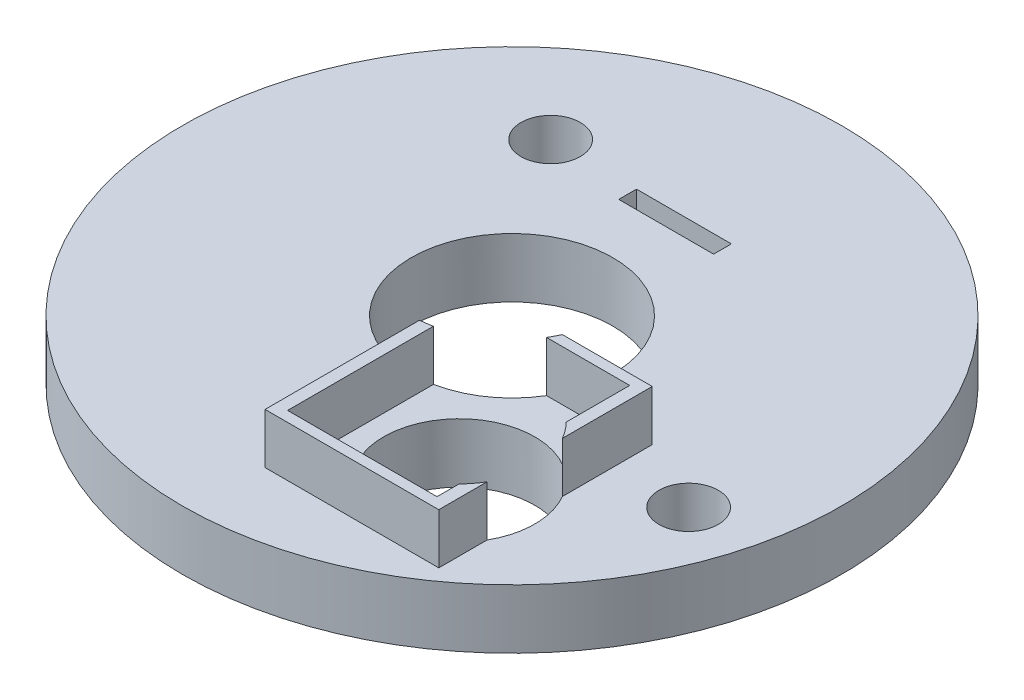
ISO-10303-21;
HEADER;
FILE_DESCRIPTION(('STEP AP214'),'2;1');
FILE_NAME('part.step','',(''),(''),'','','');
FILE_SCHEMA(('AUTOMOTIVE_DESIGN { 1 0 10303 214 1 1 1 1 }'));
ENDSEC;
DATA;
#1=APPLICATION_CONTEXT('core data for automotive mechanical design processes');
#2=APPLICATION_PROTOCOL_DEFINITION('international standard','automotive_design',2000,#1);
#3=PRODUCT_CONTEXT('',#1,'mechanical');
#4=PRODUCT('Part','Part','',(#3));
#5=PRODUCT_RELATED_PRODUCT_CATEGORY('part','',(#4));
#6=PRODUCT_DEFINITION_FORMATION('','',#4);
#7=PRODUCT_DEFINITION_CONTEXT('part definition',#1,'design');
#8=PRODUCT_DEFINITION('design','',#6,#7);
#9=PRODUCT_DEFINITION_SHAPE('','',#8);
#10=(LENGTH_UNIT() NAMED_UNIT(*) SI_UNIT(.MILLI.,.METRE.));
#11=(NAMED_UNIT(*) PLANE_ANGLE_UNIT() SI_UNIT($,.RADIAN.));
#12=(NAMED_UNIT(*) SI_UNIT($,.STERADIAN.) SOLID_ANGLE_UNIT());
#13=UNCERTAINTY_MEASURE_WITH_UNIT(LENGTH_MEASURE(1.E-05),#10,'distance_accuracy_value','');
#14=(GEOMETRIC_REPRESENTATION_CONTEXT(3) GLOBAL_UNCERTAINTY_ASSIGNED_CONTEXT((#13)) GLOBAL_UNIT_ASSIGNED_CONTEXT((#10,
#11,#12)) REPRESENTATION_CONTEXT('',''));
#15=CARTESIAN_POINT('',(0.,0.,0.));
#16=DIRECTION('',(0.,0.,1.));
#17=DIRECTION('',(1.,0.,0.));
#18=AXIS2_PLACEMENT_3D('',#15,#16,#17);
#19=CARTESIAN_POINT('',(0.,8.5,0.));
#20=DIRECTION('',(0.,-1.,0.));
#21=DIRECTION('',(0.,0.,-1.));
#22=AXIS2_PLACEMENT_3D('',#19,#20,#21);
#23=PLANE('',#22);
#24=CARTESIAN_POINT('',(0.,8.5,0.));
#25=DIRECTION('',(0.,-1.,0.));
#26=DIRECTION('',(0.,0.,-1.));
#27=AXIS2_PLACEMENT_3D('',#24,#25,#26);
#28=CIRCLE('',#27,17.);
#29=CARTESIAN_POINT('',(1.35,8.5,16.9463122832078));
#30=VERTEX_POINT('',#29);
#31=CARTESIAN_POINT('',(3.4,8.5,16.6565302509256));
#32=VERTEX_POINT('',#31);
#33=EDGE_CURVE('E257',#30,#32,#28,.F.);
#34=ORIENTED_EDGE('',*,*,#33,.F.);
#35=DIRECTION('',(0.,0.,1.));
#36=VECTOR('',#35,1.);
#37=CARTESIAN_POINT('',(1.35,8.5,7.00000000000001));
#38=LINE('',#37,#36);
#39=CARTESIAN_POINT('',(1.35,8.5,43.));
#40=VERTEX_POINT('',#39);
#41=EDGE_CURVE('E358',#30,#40,#38,.T.);
#42=ORIENTED_EDGE('',*,*,#41,.T.);
#43=DIRECTION('',(1.,0.,0.));
#44=VECTOR('',#43,1.);
#45=CARTESIAN_POINT('',(1.35,8.5,43.));
#46=LINE('',#45,#44);
#47=CARTESIAN_POINT('',(30.65,8.5,43.));
#48=VERTEX_POINT('',#47);
#49=EDGE_CURVE('E345',#40,#48,#46,.T.);
#50=ORIENTED_EDGE('',*,*,#49,.T.);
#51=DIRECTION('',(0.,0.,1.));
#52=VECTOR('',#51,1.);
#53=CARTESIAN_POINT('',(30.65,8.5,7.00000000000001));
#54=LINE('',#53,#52);
#55=CARTESIAN_POINT('',(30.65,8.5,34.8608175575157));
#56=VERTEX_POINT('',#55);
#57=EDGE_CURVE('E349',#56,#48,#54,.T.);
#58=ORIENTED_EDGE('',*,*,#57,.F.);
#59=CARTESIAN_POINT('',(19.6,8.5,28.5));
#60=DIRECTION('',(0.,-1.,0.));
#61=DIRECTION('',(0.,0.,-1.));
#62=AXIS2_PLACEMENT_3D('',#59,#60,#61);
#63=CIRCLE('',#62,12.75);
#64=CARTESIAN_POINT('',(28.6,8.5,37.5311959340942));
#65=VERTEX_POINT('',#64);
#66=EDGE_CURVE('E282',#65,#56,#63,.F.);
#67=ORIENTED_EDGE('',*,*,#66,.F.);
#68=DIRECTION('',(0.,0.,1.));
#69=VECTOR('',#68,1.);
#70=CARTESIAN_POINT('',(28.6,8.5,8.75));
#71=LINE('',#70,#69);
#72=CARTESIAN_POINT('',(28.6,8.5,41.25));
#73=VERTEX_POINT('',#72);
#74=EDGE_CURVE('E302',#65,#73,#71,.T.);
#75=ORIENTED_EDGE('',*,*,#74,.T.);
#76=DIRECTION('',(1.,0.,0.));
#77=VECTOR('',#76,1.);
#78=CARTESIAN_POINT('',(3.4,8.5,41.25));
#79=LINE('',#78,#77);
#80=CARTESIAN_POINT('',(3.4,8.5,41.25));
#81=VERTEX_POINT('',#80);
#82=EDGE_CURVE('E299',#81,#73,#79,.T.);
#83=ORIENTED_EDGE('',*,*,#82,.F.);
#84=DIRECTION('',(0.,0.,1.));
#85=VECTOR('',#84,1.);
#86=CARTESIAN_POINT('',(3.4,8.5,8.75));
#87=LINE('',#86,#85);
#88=EDGE_CURVE('E311',#32,#81,#87,.T.);
#89=ORIENTED_EDGE('',*,*,#88,.F.);
#90=EDGE_LOOP('',(#34,#42,#50,#58,#67,#75,#83,#89));
#91=FACE_BOUND('',#90,.T.);
#92=ADVANCED_FACE('F68',(#91),#23,.F.);
#93=CARTESIAN_POINT('',(1.35,8.5,7.00000000000001));
#94=DIRECTION('',(0.,0.,-1.));
#95=DIRECTION('',(-1.,0.,0.));
#96=AXIS2_PLACEMENT_3D('',#93,#94,#95);
#97=PLANE('',#96);
#98=DIRECTION('',(1.,0.,0.));
#99=VECTOR('',#98,1.);
#100=CARTESIAN_POINT('',(1.35,0.,7.00000000000001));
#101=LINE('',#100,#99);
#102=CARTESIAN_POINT('',(15.4919333848297,0.,7.00000000000001));
#103=VERTEX_POINT('',#102);
#104=CARTESIAN_POINT('',(30.65,0.,7.00000000000001));
#105=VERTEX_POINT('',#104);
#106=EDGE_CURVE('E332',#103,#105,#101,.T.);
#107=ORIENTED_EDGE('',*,*,#106,.F.);
#108=DIRECTION('',(0.,-1.,0.));
#109=VECTOR('',#108,1.);
#110=CARTESIAN_POINT('',(15.4919333848297,10.,7.00000000000001));
#111=LINE('',#110,#109);
#112=CARTESIAN_POINT('',(15.4919333848297,8.5,7.00000000000001));
#113=VERTEX_POINT('',#112);
#114=EDGE_CURVE('E270',#103,#113,#111,.F.);
#115=ORIENTED_EDGE('',*,*,#114,.T.);
#116=DIRECTION('',(1.,0.,0.));
#117=VECTOR('',#116,1.);
#118=CARTESIAN_POINT('',(1.35,8.5,7.00000000000001));
#119=LINE('',#118,#117);
#120=CARTESIAN_POINT('',(30.65,8.5,7.00000000000001));
#121=VERTEX_POINT('',#120);
#122=EDGE_CURVE('E355',#113,#121,#119,.T.);
#123=ORIENTED_EDGE('',*,*,#122,.T.);
#124=DIRECTION('',(0.,-1.,0.));
#125=VECTOR('',#124,1.);
#126=CARTESIAN_POINT('',(30.65,8.5,7.00000000000001));
#127=LINE('',#126,#125);
#128=EDGE_CURVE('E379',#121,#105,#127,.T.);
#129=ORIENTED_EDGE('',*,*,#128,.T.);
#130=EDGE_LOOP('',(#107,#115,#123,#129));
#131=FACE_BOUND('',#130,.T.);
#132=ADVANCED_FACE('F438',(#131),#97,.T.);
#133=CARTESIAN_POINT('',(1.35,8.5,7.00000000000001));
#134=DIRECTION('',(1.,0.,0.));
#135=DIRECTION('',(0.,0.,-1.));
#136=AXIS2_PLACEMENT_3D('',#133,#134,#135);
#137=PLANE('',#136);
#138=DIRECTION('',(0.,-1.,0.));
#139=VECTOR('',#138,1.);
#140=CARTESIAN_POINT('',(1.35,10.,16.9463122832078));
#141=LINE('',#140,#139);
#142=CARTESIAN_POINT('',(1.35,0.,16.9463122832078));
#143=VERTEX_POINT('',#142);
#144=EDGE_CURVE('E263',#143,#30,#141,.F.);
#145=ORIENTED_EDGE('',*,*,#144,.F.);
#146=DIRECTION('',(0.,0.,1.));
#147=VECTOR('',#146,1.);
#148=CARTESIAN_POINT('',(1.35,0.,7.00000000000001));
#149=LINE('',#148,#147);
#150=CARTESIAN_POINT('',(1.35,0.,43.));
#151=VERTEX_POINT('',#150);
#152=EDGE_CURVE('E371',#143,#151,#149,.T.);
#153=ORIENTED_EDGE('',*,*,#152,.T.);
#154=DIRECTION('',(0.,-1.,0.));
#155=VECTOR('',#154,1.);
#156=CARTESIAN_POINT('',(1.35,8.5,43.));
#157=LINE('',#156,#155);
#158=EDGE_CURVE('E361',#40,#151,#157,.T.);
#159=ORIENTED_EDGE('',*,*,#158,.F.);
#160=ORIENTED_EDGE('',*,*,#41,.F.);
#161=EDGE_LOOP('',(#145,#153,#159,#160));
#162=FACE_BOUND('',#161,.T.);
#163=ADVANCED_FACE('F455',(#162),#137,.F.);
#164=CARTESIAN_POINT('',(3.4,8.5,8.75));
#165=DIRECTION('',(0.,0.,-1.));
#166=DIRECTION('',(-1.,0.,0.));
#167=AXIS2_PLACEMENT_3D('',#164,#165,#166);
#168=PLANE('',#167);
#169=DIRECTION('',(0.,-1.,0.));
#170=VECTOR('',#169,1.);
#171=CARTESIAN_POINT('',(14.5752358471484,10.,8.75));
#172=LINE('',#171,#170);
#173=CARTESIAN_POINT('',(14.5752358471484,0.,8.75));
#174=VERTEX_POINT('',#173);
#175=CARTESIAN_POINT('',(14.5752358471484,8.5,8.75));
#176=VERTEX_POINT('',#175);
#177=EDGE_CURVE('E267',#174,#176,#172,.F.);
#178=ORIENTED_EDGE('',*,*,#177,.F.);
#179=DIRECTION('',(1.,0.,0.));
#180=VECTOR('',#179,1.);
#181=CARTESIAN_POINT('',(3.4,0.,8.75));
#182=LINE('',#181,#180);
#183=CARTESIAN_POINT('',(28.6,0.,8.75));
#184=VERTEX_POINT('',#183);
#185=EDGE_CURVE('E324',#174,#184,#182,.T.);
#186=ORIENTED_EDGE('',*,*,#185,.T.);
#187=DIRECTION('',(0.,-1.,0.));
#188=VECTOR('',#187,1.);
#189=CARTESIAN_POINT('',(28.6,8.5,8.75));
#190=LINE('',#189,#188);
#191=CARTESIAN_POINT('',(28.6,8.5,8.75));
#192=VERTEX_POINT('',#191);
#193=EDGE_CURVE('E336',#192,#184,#190,.T.);
#194=ORIENTED_EDGE('',*,*,#193,.F.);
#195=DIRECTION('',(1.,0.,0.));
#196=VECTOR('',#195,1.);
#197=CARTESIAN_POINT('',(3.4,8.5,8.75));
#198=LINE('',#197,#196);
#199=EDGE_CURVE('E308',#176,#192,#198,.T.);
#200=ORIENTED_EDGE('',*,*,#199,.F.);
#201=EDGE_LOOP('',(#178,#186,#194,#200));
#202=FACE_BOUND('',#201,.T.);
#203=ADVANCED_FACE('F483',(#202),#168,.F.);
#204=CARTESIAN_POINT('',(3.4,8.5,8.75));
#205=DIRECTION('',(1.,0.,0.));
#206=DIRECTION('',(0.,0.,-1.));
#207=AXIS2_PLACEMENT_3D('',#204,#205,#206);
#208=PLANE('',#207);
#209=DIRECTION('',(0.,0.,1.));
#210=VECTOR('',#209,1.);
#211=CARTESIAN_POINT('',(3.4,0.,8.75));
#212=LINE('',#211,#210);
#213=CARTESIAN_POINT('',(3.4,0.,16.6565302509256));
#214=VERTEX_POINT('',#213);
#215=CARTESIAN_POINT('',(3.4,0.,41.25));
#216=VERTEX_POINT('',#215);
#217=EDGE_CURVE('E328',#214,#216,#212,.T.);
#218=ORIENTED_EDGE('',*,*,#217,.F.);
#219=DIRECTION('',(0.,-1.,0.));
#220=VECTOR('',#219,1.);
#221=CARTESIAN_POINT('',(3.4,10.,16.6565302509256));
#222=LINE('',#221,#220);
#223=EDGE_CURVE('E12',#214,#32,#222,.F.);
#224=ORIENTED_EDGE('',*,*,#223,.T.);
#225=ORIENTED_EDGE('',*,*,#88,.T.);
#226=DIRECTION('',(0.,-1.,0.));
#227=VECTOR('',#226,1.);
#228=CARTESIAN_POINT('',(3.4,8.5,41.25));
#229=LINE('',#228,#227);
#230=EDGE_CURVE('E314',#81,#216,#229,.T.);
#231=ORIENTED_EDGE('',*,*,#230,.T.);
#232=EDGE_LOOP('',(#218,#224,#225,#231));
#233=FACE_BOUND('',#232,.T.);
#234=ADVANCED_FACE('F472',(#233),#208,.T.);
#235=CARTESIAN_POINT('',(0.,0.,0.));
#236=DIRECTION('',(0.,1.,0.));
#237=DIRECTION('',(0.,0.,1.));
#238=AXIS2_PLACEMENT_3D('',#235,#236,#237);
#239=PLANE('',#238);
#240=DIRECTION('',(1.,0.,0.));
#241=VECTOR('',#240,1.);
#242=CARTESIAN_POINT('',(3.4,0.,41.25));
#243=LINE('',#242,#241);
#244=CARTESIAN_POINT('',(19.6,0.,41.25));
#245=VERTEX_POINT('',#244);
#246=EDGE_CURVE('E315',#216,#245,#243,.T.);
#247=ORIENTED_EDGE('',*,*,#246,.T.);
#248=CARTESIAN_POINT('',(19.6,0.,28.5));
#249=DIRECTION('',(0.,1.,0.));
#250=DIRECTION('',(0.,0.,1.));
#251=AXIS2_PLACEMENT_3D('',#248,#249,#250);
#252=CIRCLE('',#251,12.75);
#253=CARTESIAN_POINT('',(28.6,0.,19.4688040659058));
#254=VERTEX_POINT('',#253);
#255=EDGE_CURVE('E281',#245,#254,#252,.F.);
#256=ORIENTED_EDGE('',*,*,#255,.T.);
#257=DIRECTION('',(0.,0.,1.));
#258=VECTOR('',#257,1.);
#259=CARTESIAN_POINT('',(28.6,0.,8.75));
#260=LINE('',#259,#258);
#261=EDGE_CURVE('E303',#184,#254,#260,.T.);
#262=ORIENTED_EDGE('',*,*,#261,.F.);
#263=ORIENTED_EDGE('',*,*,#185,.F.);
#264=CARTESIAN_POINT('',(0.,0.,0.));
#265=DIRECTION('',(0.,1.,0.));
#266=DIRECTION('',(0.,0.,1.));
#267=AXIS2_PLACEMENT_3D('',#264,#265,#266);
#268=CIRCLE('',#267,17.);
#269=EDGE_CURVE('E393',#214,#174,#268,.T.);
#270=ORIENTED_EDGE('',*,*,#269,.F.);
#271=ORIENTED_EDGE('',*,*,#217,.T.);
#272=EDGE_LOOP('',(#247,#256,#262,#263,#270,#271));
#273=FACE_BOUND('',#272,.T.);
#274=ADVANCED_FACE('F469',(#273),#239,.T.);
#275=CARTESIAN_POINT('',(30.65,8.5,7.00000000000001));
#276=DIRECTION('',(1.,0.,0.));
#277=DIRECTION('',(0.,0.,-1.));
#278=AXIS2_PLACEMENT_3D('',#275,#276,#277);
#279=PLANE('',#278);
#280=DIRECTION('',(0.,0.,1.));
#281=VECTOR('',#280,1.);
#282=CARTESIAN_POINT('',(30.65,0.,7.00000000000001));
#283=LINE('',#282,#281);
#284=CARTESIAN_POINT('',(30.65,0.,34.8608175575157));
#285=VERTEX_POINT('',#284);
#286=CARTESIAN_POINT('',(30.65,0.,43.));
#287=VERTEX_POINT('',#286);
#288=EDGE_CURVE('E365',#285,#287,#283,.T.);
#289=ORIENTED_EDGE('',*,*,#288,.F.);
#290=DIRECTION('',(0.,-1.,0.));
#291=VECTOR('',#290,1.);
#292=CARTESIAN_POINT('',(30.65,10.,34.8608175575157));
#293=LINE('',#292,#291);
#294=EDGE_CURVE('E295',#285,#56,#293,.F.);
#295=ORIENTED_EDGE('',*,*,#294,.T.);
#296=ORIENTED_EDGE('',*,*,#57,.T.);
#297=DIRECTION('',(0.,-1.,0.));
#298=VECTOR('',#297,1.);
#299=CARTESIAN_POINT('',(30.65,8.5,43.));
#300=LINE('',#299,#298);
#301=EDGE_CURVE('E383',#48,#287,#300,.T.);
#302=ORIENTED_EDGE('',*,*,#301,.T.);
#303=EDGE_LOOP('',(#289,#295,#296,#302));
#304=FACE_BOUND('',#303,.T.);
#305=ADVANCED_FACE('F461',(#304),#279,.T.);
#306=CARTESIAN_POINT('',(30.65,8.5,22.1391824424843));
#307=VERTEX_POINT('',#306);
#308=EDGE_CURVE('E351',#121,#307,#54,.T.);
#309=ORIENTED_EDGE('',*,*,#308,.T.);
#310=DIRECTION('',(0.,-1.,0.));
#311=VECTOR('',#310,1.);
#312=CARTESIAN_POINT('',(30.65,10.,22.1391824424843));
#313=LINE('',#312,#311);
#314=CARTESIAN_POINT('',(30.65,0.,22.1391824424843));
#315=VERTEX_POINT('',#314);
#316=EDGE_CURVE('E286',#307,#315,#313,.T.);
#317=ORIENTED_EDGE('',*,*,#316,.T.);
#318=EDGE_CURVE('E350',#105,#315,#283,.T.);
#319=ORIENTED_EDGE('',*,*,#318,.F.);
#320=ORIENTED_EDGE('',*,*,#128,.F.);
#321=EDGE_LOOP('',(#309,#317,#319,#320));
#322=FACE_BOUND('',#321,.T.);
#323=ADVANCED_FACE('F444',(#322),#279,.T.);
#324=CARTESIAN_POINT('',(28.6,8.5,8.75));
#325=DIRECTION('',(1.,0.,0.));
#326=DIRECTION('',(0.,0.,-1.));
#327=AXIS2_PLACEMENT_3D('',#324,#325,#326);
#328=PLANE('',#327);
#329=DIRECTION('',(0.,-1.,0.));
#330=VECTOR('',#329,1.);
#331=CARTESIAN_POINT('',(28.6,10.,37.5311959340942));
#332=LINE('',#331,#330);
#333=CARTESIAN_POINT('',(28.6,0.,37.5311959340942));
#334=VERTEX_POINT('',#333);
#335=EDGE_CURVE('E77',#334,#65,#332,.F.);
#336=ORIENTED_EDGE('',*,*,#335,.F.);
#337=CARTESIAN_POINT('',(28.6,0.,41.25));
#338=VERTEX_POINT('',#337);
#339=EDGE_CURVE('E319',#334,#338,#260,.T.);
#340=ORIENTED_EDGE('',*,*,#339,.T.);
#341=DIRECTION('',(0.,-1.,0.));
#342=VECTOR('',#341,1.);
#343=CARTESIAN_POINT('',(28.6,8.5,41.25));
#344=LINE('',#343,#342);
#345=EDGE_CURVE('E340',#73,#338,#344,.T.);
#346=ORIENTED_EDGE('',*,*,#345,.F.);
#347=ORIENTED_EDGE('',*,*,#74,.F.);
#348=EDGE_LOOP('',(#336,#340,#346,#347));
#349=FACE_BOUND('',#348,.T.);
#350=ADVANCED_FACE('F422',(#349),#328,.F.);
#351=DIRECTION('',(0.,-1.,0.));
#352=VECTOR('',#351,1.);
#353=CARTESIAN_POINT('',(28.6,10.,19.4688040659058));
#354=LINE('',#353,#352);
#355=CARTESIAN_POINT('',(28.6,8.5,19.4688040659058));
#356=VERTEX_POINT('',#355);
#357=EDGE_CURVE('E375',#356,#254,#354,.T.);
#358=ORIENTED_EDGE('',*,*,#357,.F.);
#359=EDGE_CURVE('E304',#192,#356,#71,.T.);
#360=ORIENTED_EDGE('',*,*,#359,.F.);
#361=ORIENTED_EDGE('',*,*,#193,.T.);
#362=ORIENTED_EDGE('',*,*,#261,.T.);
#363=EDGE_LOOP('',(#358,#360,#361,#362));
#364=FACE_BOUND('',#363,.T.);
#365=ADVANCED_FACE('F479',(#364),#328,.F.);
#366=ORIENTED_EDGE('',*,*,#339,.F.);
#367=EDGE_CURVE('E287',#334,#245,#252,.F.);
#368=ORIENTED_EDGE('',*,*,#367,.T.);
#369=EDGE_CURVE('E320',#245,#338,#243,.T.);
#370=ORIENTED_EDGE('',*,*,#369,.T.);
#371=EDGE_LOOP('',(#366,#368,#370));
#372=FACE_BOUND('',#371,.T.);
#373=ADVANCED_FACE('F515',(#372),#239,.T.);
#374=CARTESIAN_POINT('',(0.,-10.,0.));
#375=DIRECTION('',(0.,1.,0.));
#376=DIRECTION('',(0.,0.,1.));
#377=AXIS2_PLACEMENT_3D('',#374,#375,#376);
#378=CYLINDRICAL_SURFACE('',#377,55.585);
#379=CARTESIAN_POINT('',(0.,-10.,0.));
#380=DIRECTION('',(0.,1.,0.));
#381=DIRECTION('',(0.,0.,1.));
#382=AXIS2_PLACEMENT_3D('',#379,#380,#381);
#383=CIRCLE('',#382,55.585);
#384=CARTESIAN_POINT('',(0.,-10.,55.585));
#385=VERTEX_POINT('',#384);
#386=EDGE_CURVE('E329',#385,#385,#383,.T.);
#387=ORIENTED_EDGE('',*,*,#386,.T.);
#388=EDGE_LOOP('',(#387));
#389=FACE_BOUND('',#388,.T.);
#390=CARTESIAN_POINT('',(0.,0.,0.));
#391=DIRECTION('',(0.,1.,0.));
#392=DIRECTION('',(0.,0.,1.));
#393=AXIS2_PLACEMENT_3D('',#390,#391,#392);
#394=CIRCLE('',#393,55.585);
#395=CARTESIAN_POINT('',(0.,0.,55.585));
#396=VERTEX_POINT('',#395);
#397=EDGE_CURVE('E392',#396,#396,#394,.T.);
#398=ORIENTED_EDGE('',*,*,#397,.F.);
#399=EDGE_LOOP('',(#398));
#400=FACE_BOUND('',#399,.T.);
#401=ADVANCED_FACE('F70',(#389,#400),#378,.T.);
#402=CARTESIAN_POINT('',(0.,-10.,0.));
#403=DIRECTION('',(0.,1.,0.));
#404=DIRECTION('',(0.,0.,1.));
#405=AXIS2_PLACEMENT_3D('',#402,#403,#404);
#406=PLANE('',#405);
#407=DIRECTION('',(0.,0.,1.));
#408=VECTOR('',#407,1.);
#409=CARTESIAN_POINT('',(-8.,-10.,-29.));
#410=LINE('',#409,#408);
#411=CARTESIAN_POINT('',(-8.,-10.,-29.));
#412=VERTEX_POINT('',#411);
#413=CARTESIAN_POINT('',(-8.,-10.,-26.));
#414=VERTEX_POINT('',#413);
#415=EDGE_CURVE('E211',#412,#414,#410,.T.);
#416=ORIENTED_EDGE('',*,*,#415,.T.);
#417=DIRECTION('',(1.,0.,0.));
#418=VECTOR('',#417,1.);
#419=CARTESIAN_POINT('',(-8.,-10.,-26.));
#420=LINE('',#419,#418);
#421=CARTESIAN_POINT('',(8.,-10.,-26.));
#422=VERTEX_POINT('',#421);
#423=EDGE_CURVE('E205',#414,#422,#420,.T.);
#424=ORIENTED_EDGE('',*,*,#423,.T.);
#425=DIRECTION('',(0.,0.,1.));
#426=VECTOR('',#425,1.);
#427=CARTESIAN_POINT('',(8.,-10.,-29.));
#428=LINE('',#427,#426);
#429=CARTESIAN_POINT('',(8.,-10.,-29.));
#430=VERTEX_POINT('',#429);
#431=EDGE_CURVE('E196',#430,#422,#428,.T.);
#432=ORIENTED_EDGE('',*,*,#431,.F.);
#433=DIRECTION('',(1.,0.,0.));
#434=VECTOR('',#433,1.);
#435=CARTESIAN_POINT('',(-8.,-10.,-29.));
#436=LINE('',#435,#434);
#437=EDGE_CURVE('E204',#412,#430,#436,.T.);
#438=ORIENTED_EDGE('',*,*,#437,.F.);
#439=EDGE_LOOP('',(#416,#424,#432,#438));
#440=FACE_BOUND('',#439,.T.);
#441=CARTESIAN_POINT('',(-22.4827381014672,-10.,-29.));
#442=DIRECTION('',(0.,1.,0.));
#443=DIRECTION('',(0.,0.,1.));
#444=AXIS2_PLACEMENT_3D('',#441,#442,#443);
#445=CIRCLE('',#444,5.);
#446=CARTESIAN_POINT('',(-22.4827381014672,-10.,-24.));
#447=VERTEX_POINT('',#446);
#448=EDGE_CURVE('E249',#447,#447,#445,.T.);
#449=ORIENTED_EDGE('',*,*,#448,.T.);
#450=EDGE_LOOP('',(#449));
#451=FACE_BOUND('',#450,.T.);
#452=CARTESIAN_POINT('',(42.8777933792266,-10.,13.0881653947827));
#453=DIRECTION('',(0.,1.,0.));
#454=DIRECTION('',(0.,0.,1.));
#455=AXIS2_PLACEMENT_3D('',#452,#453,#454);
#456=CIRCLE('',#455,5.);
#457=CARTESIAN_POINT('',(42.8777933792266,-10.,18.0881653947827));
#458=VERTEX_POINT('',#457);
#459=EDGE_CURVE('E253',#458,#458,#456,.T.);
#460=ORIENTED_EDGE('',*,*,#459,.T.);
#461=EDGE_LOOP('',(#460));
#462=FACE_BOUND('',#461,.T.);
#463=CARTESIAN_POINT('',(19.6,-10.,28.5));
#464=DIRECTION('',(0.,1.,0.));
#465=DIRECTION('',(0.,0.,1.));
#466=AXIS2_PLACEMENT_3D('',#463,#464,#465);
#467=CIRCLE('',#466,12.75);
#468=CARTESIAN_POINT('',(19.6,-10.,41.25));
#469=VERTEX_POINT('',#468);
#470=EDGE_CURVE('E274',#469,#469,#467,.T.);
#471=ORIENTED_EDGE('',*,*,#470,.T.);
#472=EDGE_LOOP('',(#471));
#473=FACE_BOUND('',#472,.T.);
#474=CARTESIAN_POINT('',(0.,-10.,0.));
#475=DIRECTION('',(0.,1.,0.));
#476=DIRECTION('',(0.,0.,1.));
#477=AXIS2_PLACEMENT_3D('',#474,#475,#476);
#478=CIRCLE('',#477,17.);
#479=CARTESIAN_POINT('',(0.,-10.,17.));
#480=VERTEX_POINT('',#479);
#481=EDGE_CURVE('E388',#480,#480,#478,.T.);
#482=ORIENTED_EDGE('',*,*,#481,.T.);
#483=EDGE_LOOP('',(#482));
#484=FACE_BOUND('',#483,.T.);
#485=ORIENTED_EDGE('',*,*,#386,.F.);
#486=EDGE_LOOP('',(#485));
#487=FACE_BOUND('',#486,.T.);
#488=ADVANCED_FACE('F213',(#440,#451,#462,#473,#484,#487),#406,.F.);
#489=DIRECTION('',(1.,0.,0.));
#490=VECTOR('',#489,1.);
#491=CARTESIAN_POINT('',(-8.,0.,-26.));
#492=LINE('',#491,#490);
#493=CARTESIAN_POINT('',(-8.,0.,-26.));
#494=VERTEX_POINT('',#493);
#495=CARTESIAN_POINT('',(8.,0.,-26.));
#496=VERTEX_POINT('',#495);
#497=EDGE_CURVE('E92',#494,#496,#492,.T.);
#498=ORIENTED_EDGE('',*,*,#497,.F.);
#499=DIRECTION('',(0.,0.,1.));
#500=VECTOR('',#499,1.);
#501=CARTESIAN_POINT('',(-8.,0.,-29.));
#502=LINE('',#501,#500);
#503=CARTESIAN_POINT('',(-8.,0.,-29.));
#504=VERTEX_POINT('',#503);
#505=EDGE_CURVE('E217',#504,#494,#502,.T.);
#506=ORIENTED_EDGE('',*,*,#505,.F.);
#507=DIRECTION('',(1.,0.,0.));
#508=VECTOR('',#507,1.);
#509=CARTESIAN_POINT('',(-8.,0.,-29.));
#510=LINE('',#509,#508);
#511=CARTESIAN_POINT('',(8.,0.,-29.));
#512=VERTEX_POINT('',#511);
#513=EDGE_CURVE('E221',#504,#512,#510,.T.);
#514=ORIENTED_EDGE('',*,*,#513,.T.);
#515=DIRECTION('',(0.,0.,1.));
#516=VECTOR('',#515,1.);
#517=CARTESIAN_POINT('',(8.,0.,-29.));
#518=LINE('',#517,#516);
#519=EDGE_CURVE('E230',#512,#496,#518,.T.);
#520=ORIENTED_EDGE('',*,*,#519,.T.);
#521=EDGE_LOOP('',(#498,#506,#514,#520));
#522=FACE_BOUND('',#521,.T.);
#523=CARTESIAN_POINT('',(-22.4827381014672,0.,-29.));
#524=DIRECTION('',(0.,1.,0.));
#525=DIRECTION('',(0.,0.,1.));
#526=AXIS2_PLACEMENT_3D('',#523,#524,#525);
#527=CIRCLE('',#526,5.);
#528=CARTESIAN_POINT('',(-22.4827381014672,0.,-24.));
#529=VERTEX_POINT('',#528);
#530=EDGE_CURVE('E231',#529,#529,#527,.T.);
#531=ORIENTED_EDGE('',*,*,#530,.F.);
#532=EDGE_LOOP('',(#531));
#533=FACE_BOUND('',#532,.T.);
#534=CARTESIAN_POINT('',(42.8777933792266,0.,13.0881653947827));
#535=DIRECTION('',(0.,1.,0.));
#536=DIRECTION('',(0.,0.,1.));
#537=AXIS2_PLACEMENT_3D('',#534,#535,#536);
#538=CIRCLE('',#537,5.);
#539=CARTESIAN_POINT('',(42.8777933792266,0.,18.0881653947827));
#540=VERTEX_POINT('',#539);
#541=EDGE_CURVE('E240',#540,#540,#538,.T.);
#542=ORIENTED_EDGE('',*,*,#541,.F.);
#543=EDGE_LOOP('',(#542));
#544=FACE_BOUND('',#543,.T.);
#545=ORIENTED_EDGE('',*,*,#318,.T.);
#546=CARTESIAN_POINT('',(19.6,0.,28.5));
#547=DIRECTION('',(0.,1.,0.));
#548=DIRECTION('',(0.,0.,1.));
#549=AXIS2_PLACEMENT_3D('',#546,#547,#548);
#550=CIRCLE('',#549,12.75);
#551=EDGE_CURVE('E291',#315,#285,#550,.F.);
#552=ORIENTED_EDGE('',*,*,#551,.T.);
#553=ORIENTED_EDGE('',*,*,#288,.T.);
#554=DIRECTION('',(1.,0.,0.));
#555=VECTOR('',#554,1.);
#556=CARTESIAN_POINT('',(1.35,0.,43.));
#557=LINE('',#556,#555);
#558=EDGE_CURVE('E344',#151,#287,#557,.T.);
#559=ORIENTED_EDGE('',*,*,#558,.F.);
#560=ORIENTED_EDGE('',*,*,#152,.F.);
#561=EDGE_CURVE('E387',#103,#143,#268,.T.);
#562=ORIENTED_EDGE('',*,*,#561,.F.);
#563=ORIENTED_EDGE('',*,*,#106,.T.);
#564=EDGE_LOOP('',(#545,#552,#553,#559,#560,#562,#563));
#565=FACE_BOUND('',#564,.T.);
#566=ORIENTED_EDGE('',*,*,#397,.T.);
#567=EDGE_LOOP('',(#566));
#568=FACE_BOUND('',#567,.T.);
#569=ADVANCED_FACE('F447',(#522,#533,#544,#565,#568),#239,.T.);
#570=CARTESIAN_POINT('',(0.,-10.,0.));
#571=DIRECTION('',(0.,1.,0.));
#572=DIRECTION('',(0.,0.,1.));
#573=AXIS2_PLACEMENT_3D('',#570,#571,#572);
#574=CYLINDRICAL_SURFACE('',#573,17.);
#575=ORIENTED_EDGE('',*,*,#481,.F.);
#576=EDGE_LOOP('',(#575));
#577=FACE_BOUND('',#576,.T.);
#578=ORIENTED_EDGE('',*,*,#561,.T.);
#579=ORIENTED_EDGE('',*,*,#144,.T.);
#580=ORIENTED_EDGE('',*,*,#33,.T.);
#581=ORIENTED_EDGE('',*,*,#223,.F.);
#582=ORIENTED_EDGE('',*,*,#269,.T.);
#583=ORIENTED_EDGE('',*,*,#177,.T.);
#584=EDGE_CURVE('E264',#176,#113,#28,.F.);
#585=ORIENTED_EDGE('',*,*,#584,.T.);
#586=ORIENTED_EDGE('',*,*,#114,.F.);
#587=EDGE_LOOP('',(#578,#579,#580,#581,#582,#583,#585,#586));
#588=FACE_BOUND('',#587,.T.);
#589=ADVANCED_FACE('F430',(#577,#588),#574,.F.);
#590=ORIENTED_EDGE('',*,*,#584,.F.);
#591=ORIENTED_EDGE('',*,*,#199,.T.);
#592=ORIENTED_EDGE('',*,*,#359,.T.);
#593=EDGE_CURVE('E278',#307,#356,#63,.F.);
#594=ORIENTED_EDGE('',*,*,#593,.F.);
#595=ORIENTED_EDGE('',*,*,#308,.F.);
#596=ORIENTED_EDGE('',*,*,#122,.F.);
#597=EDGE_LOOP('',(#590,#591,#592,#594,#595,#596));
#598=FACE_BOUND('',#597,.T.);
#599=ADVANCED_FACE('F441',(#598),#23,.F.);
#600=CARTESIAN_POINT('',(1.35,8.5,43.));
#601=DIRECTION('',(0.,0.,-1.));
#602=DIRECTION('',(-1.,0.,0.));
#603=AXIS2_PLACEMENT_3D('',#600,#601,#602);
#604=PLANE('',#603);
#605=ORIENTED_EDGE('',*,*,#558,.T.);
#606=ORIENTED_EDGE('',*,*,#301,.F.);
#607=ORIENTED_EDGE('',*,*,#49,.F.);
#608=ORIENTED_EDGE('',*,*,#158,.T.);
#609=EDGE_LOOP('',(#605,#606,#607,#608));
#610=FACE_BOUND('',#609,.T.);
#611=ADVANCED_FACE('F459',(#610),#604,.F.);
#612=CARTESIAN_POINT('',(3.4,8.5,41.25));
#613=DIRECTION('',(0.,0.,-1.));
#614=DIRECTION('',(-1.,0.,0.));
#615=AXIS2_PLACEMENT_3D('',#612,#613,#614);
#616=PLANE('',#615);
#617=ORIENTED_EDGE('',*,*,#82,.T.);
#618=ORIENTED_EDGE('',*,*,#345,.T.);
#619=ORIENTED_EDGE('',*,*,#369,.F.);
#620=ORIENTED_EDGE('',*,*,#246,.F.);
#621=ORIENTED_EDGE('',*,*,#230,.F.);
#622=EDGE_LOOP('',(#617,#618,#619,#620,#621));
#623=FACE_BOUND('',#622,.T.);
#624=ADVANCED_FACE('F475',(#623),#616,.T.);
#625=CARTESIAN_POINT('',(19.6,10.,28.5));
#626=DIRECTION('',(0.,-1.,0.));
#627=DIRECTION('',(0.,0.,-1.));
#628=AXIS2_PLACEMENT_3D('',#625,#626,#627);
#629=CYLINDRICAL_SURFACE('',#628,12.75);
#630=ORIENTED_EDGE('',*,*,#335,.T.);
#631=ORIENTED_EDGE('',*,*,#66,.T.);
#632=ORIENTED_EDGE('',*,*,#294,.F.);
#633=ORIENTED_EDGE('',*,*,#551,.F.);
#634=ORIENTED_EDGE('',*,*,#316,.F.);
#635=ORIENTED_EDGE('',*,*,#593,.T.);
#636=ORIENTED_EDGE('',*,*,#357,.T.);
#637=ORIENTED_EDGE('',*,*,#255,.F.);
#638=ORIENTED_EDGE('',*,*,#367,.F.);
#639=EDGE_LOOP('',(#630,#631,#632,#633,#634,#635,#636,#637,#638));
#640=FACE_BOUND('',#639,.T.);
#641=ORIENTED_EDGE('',*,*,#470,.F.);
#642=EDGE_LOOP('',(#641));
#643=FACE_BOUND('',#642,.T.);
#644=ADVANCED_FACE('F408',(#640,#643),#629,.F.);
#645=CARTESIAN_POINT('',(42.8777933792266,-10.,13.0881653947827));
#646=DIRECTION('',(0.,1.,0.));
#647=DIRECTION('',(0.,0.,1.));
#648=AXIS2_PLACEMENT_3D('',#645,#646,#647);
#649=CYLINDRICAL_SURFACE('',#648,5.);
#650=ORIENTED_EDGE('',*,*,#459,.F.);
#651=EDGE_LOOP('',(#650));
#652=FACE_BOUND('',#651,.T.);
#653=ORIENTED_EDGE('',*,*,#541,.T.);
#654=EDGE_LOOP('',(#653));
#655=FACE_BOUND('',#654,.T.);
#656=ADVANCED_FACE('F549',(#652,#655),#649,.F.);
#657=CARTESIAN_POINT('',(-22.4827381014672,-10.,-29.));
#658=DIRECTION('',(0.,1.,0.));
#659=DIRECTION('',(0.,0.,1.));
#660=AXIS2_PLACEMENT_3D('',#657,#658,#659);
#661=CYLINDRICAL_SURFACE('',#660,5.);
#662=ORIENTED_EDGE('',*,*,#448,.F.);
#663=EDGE_LOOP('',(#662));
#664=FACE_BOUND('',#663,.T.);
#665=ORIENTED_EDGE('',*,*,#530,.T.);
#666=EDGE_LOOP('',(#665));
#667=FACE_BOUND('',#666,.T.);
#668=ADVANCED_FACE('F553',(#664,#667),#661,.F.);
#669=CARTESIAN_POINT('',(-8.,-10.,-26.));
#670=DIRECTION('',(0.,0.,1.));
#671=DIRECTION('',(1.,0.,0.));
#672=AXIS2_PLACEMENT_3D('',#669,#670,#671);
#673=PLANE('',#672);
#674=ORIENTED_EDGE('',*,*,#497,.T.);
#675=DIRECTION('',(0.,1.,0.));
#676=VECTOR('',#675,1.);
#677=CARTESIAN_POINT('',(8.,-10.,-26.));
#678=LINE('',#677,#676);
#679=EDGE_CURVE('E198',#422,#496,#678,.T.);
#680=ORIENTED_EDGE('',*,*,#679,.F.);
#681=ORIENTED_EDGE('',*,*,#423,.F.);
#682=DIRECTION('',(0.,1.,0.));
#683=VECTOR('',#682,1.);
#684=CARTESIAN_POINT('',(-8.,-10.,-26.));
#685=LINE('',#684,#683);
#686=EDGE_CURVE('E237',#414,#494,#685,.T.);
#687=ORIENTED_EDGE('',*,*,#686,.T.);
#688=EDGE_LOOP('',(#674,#680,#681,#687));
#689=FACE_BOUND('',#688,.T.);
#690=ADVANCED_FACE('F208',(#689),#673,.F.);
#691=CARTESIAN_POINT('',(-8.,-10.,-29.));
#692=DIRECTION('',(-1.,0.,0.));
#693=DIRECTION('',(0.,0.,1.));
#694=AXIS2_PLACEMENT_3D('',#691,#692,#693);
#695=PLANE('',#694);
#696=ORIENTED_EDGE('',*,*,#505,.T.);
#697=ORIENTED_EDGE('',*,*,#686,.F.);
#698=ORIENTED_EDGE('',*,*,#415,.F.);
#699=DIRECTION('',(0.,1.,0.));
#700=VECTOR('',#699,1.);
#701=CARTESIAN_POINT('',(-8.,-10.,-29.));
#702=LINE('',#701,#700);
#703=EDGE_CURVE('E241',#412,#504,#702,.T.);
#704=ORIENTED_EDGE('',*,*,#703,.T.);
#705=EDGE_LOOP('',(#696,#697,#698,#704));
#706=FACE_BOUND('',#705,.T.);
#707=ADVANCED_FACE('F562',(#706),#695,.F.);
#708=CARTESIAN_POINT('',(-8.,-10.,-29.));
#709=DIRECTION('',(0.,0.,1.));
#710=DIRECTION('',(1.,0.,0.));
#711=AXIS2_PLACEMENT_3D('',#708,#709,#710);
#712=PLANE('',#711);
#713=ORIENTED_EDGE('',*,*,#513,.F.);
#714=ORIENTED_EDGE('',*,*,#703,.F.);
#715=ORIENTED_EDGE('',*,*,#437,.T.);
#716=DIRECTION('',(0.,1.,0.));
#717=VECTOR('',#716,1.);
#718=CARTESIAN_POINT('',(8.,-10.,-29.));
#719=LINE('',#718,#717);
#720=EDGE_CURVE('E84',#430,#512,#719,.T.);
#721=ORIENTED_EDGE('',*,*,#720,.T.);
#722=EDGE_LOOP('',(#713,#714,#715,#721));
#723=FACE_BOUND('',#722,.T.);
#724=ADVANCED_FACE('F565',(#723),#712,.T.);
#725=CARTESIAN_POINT('',(8.,-10.,-29.));
#726=DIRECTION('',(-1.,0.,0.));
#727=DIRECTION('',(0.,0.,1.));
#728=AXIS2_PLACEMENT_3D('',#725,#726,#727);
#729=PLANE('',#728);
#730=ORIENTED_EDGE('',*,*,#519,.F.);
#731=ORIENTED_EDGE('',*,*,#720,.F.);
#732=ORIENTED_EDGE('',*,*,#431,.T.);
#733=ORIENTED_EDGE('',*,*,#679,.T.);
#734=EDGE_LOOP('',(#730,#731,#732,#733));
#735=FACE_BOUND('',#734,.T.);
#736=ADVANCED_FACE('F197',(#735),#729,.T.);
#737=CLOSED_SHELL('',(#92,#132,#163,#203,#234,#274,#305,#323,#350,#365,#373,#401,#488,#569,#589,
#599,#611,#624,#644,#656,#668,#690,#707,#724,#736));
#738=MANIFOLD_SOLID_BREP('B2',#737);
#739=ADVANCED_BREP_SHAPE_REPRESENTATION('',(#18,#738),#14);
#740=SHAPE_DEFINITION_REPRESENTATION(#9,#739);
ENDSEC;
END-ISO-10303-21;
